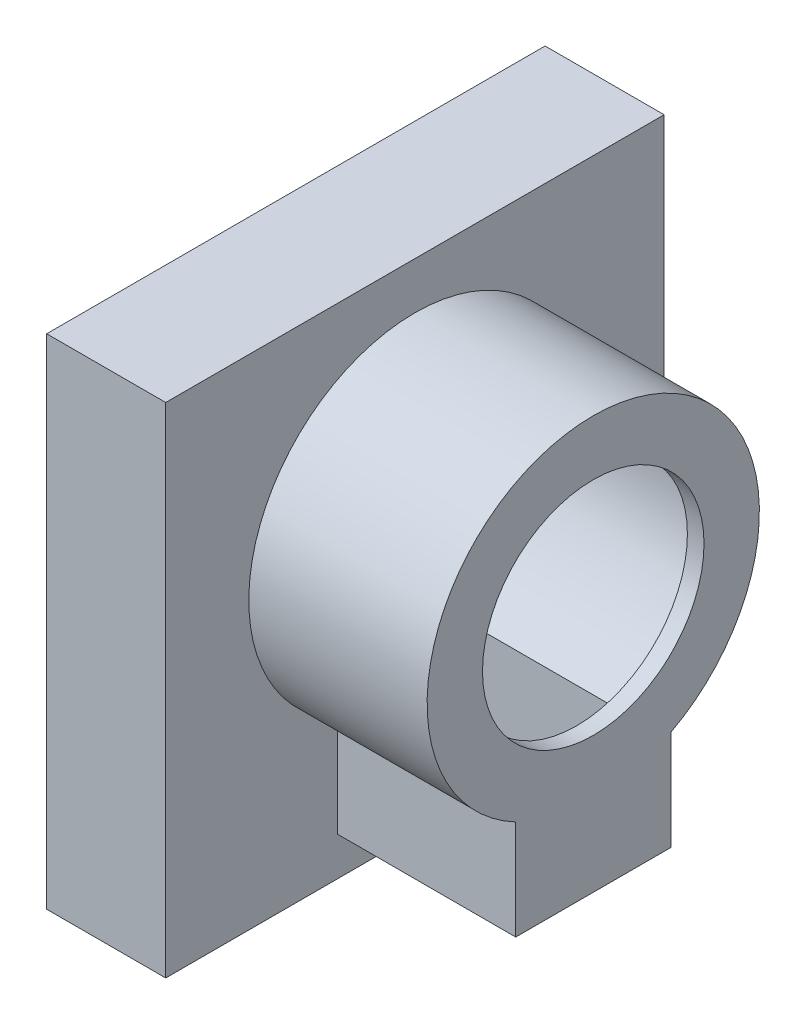
ISO-10303-21;
HEADER;
FILE_DESCRIPTION(('STEP AP214'),'2;1');
FILE_NAME('part.step','',(''),(''),'','','');
FILE_SCHEMA(('AUTOMOTIVE_DESIGN { 1 0 10303 214 1 1 1 1 }'));
ENDSEC;
DATA;
#1=APPLICATION_CONTEXT('core data for automotive mechanical design processes');
#2=APPLICATION_PROTOCOL_DEFINITION('international standard','automotive_design',2000,#1);
#3=PRODUCT_CONTEXT('',#1,'mechanical');
#4=PRODUCT('Part','Part','',(#3));
#5=PRODUCT_RELATED_PRODUCT_CATEGORY('part','',(#4));
#6=PRODUCT_DEFINITION_FORMATION('','',#4);
#7=PRODUCT_DEFINITION_CONTEXT('part definition',#1,'design');
#8=PRODUCT_DEFINITION('design','',#6,#7);
#9=PRODUCT_DEFINITION_SHAPE('','',#8);
#10=(LENGTH_UNIT() NAMED_UNIT(*) SI_UNIT(.MILLI.,.METRE.));
#11=(NAMED_UNIT(*) PLANE_ANGLE_UNIT() SI_UNIT($,.RADIAN.));
#12=(NAMED_UNIT(*) SI_UNIT($,.STERADIAN.) SOLID_ANGLE_UNIT());
#13=UNCERTAINTY_MEASURE_WITH_UNIT(LENGTH_MEASURE(1.E-05),#10,'distance_accuracy_value','');
#14=(GEOMETRIC_REPRESENTATION_CONTEXT(3) GLOBAL_UNCERTAINTY_ASSIGNED_CONTEXT((#13)) GLOBAL_UNIT_ASSIGNED_CONTEXT((#10,
#11,#12)) REPRESENTATION_CONTEXT('',''));
#15=CARTESIAN_POINT('',(0.,0.,0.));
#16=DIRECTION('',(0.,0.,1.));
#17=DIRECTION('',(1.,0.,0.));
#18=AXIS2_PLACEMENT_3D('',#15,#16,#17);
#19=CARTESIAN_POINT('',(0.,0.,0.));
#20=DIRECTION('',(-1.,0.,0.));
#21=DIRECTION('',(0.,0.,1.));
#22=AXIS2_PLACEMENT_3D('',#19,#20,#21);
#23=PLANE('',#22);
#24=DIRECTION('',(0.,1.,0.));
#25=VECTOR('',#24,1.);
#26=CARTESIAN_POINT('',(0.,-9.,-9.));
#27=LINE('',#26,#25);
#28=CARTESIAN_POINT('',(0.,-9.,-9.));
#29=VERTEX_POINT('',#28);
#30=CARTESIAN_POINT('',(0.,9.,-9.));
#31=VERTEX_POINT('',#30);
#32=EDGE_CURVE('E298',#29,#31,#27,.T.);
#33=ORIENTED_EDGE('',*,*,#32,.F.);
#34=DIRECTION('',(0.,0.,-1.));
#35=VECTOR('',#34,1.);
#36=CARTESIAN_POINT('',(0.,-9.,9.));
#37=LINE('',#36,#35);
#38=CARTESIAN_POINT('',(0.,-9.,9.));
#39=VERTEX_POINT('',#38);
#40=EDGE_CURVE('E304',#39,#29,#37,.T.);
#41=ORIENTED_EDGE('',*,*,#40,.F.);
#42=DIRECTION('',(0.,-1.,0.));
#43=VECTOR('',#42,1.);
#44=CARTESIAN_POINT('',(0.,-9.,9.));
#45=LINE('',#44,#43);
#46=CARTESIAN_POINT('',(0.,9.,9.));
#47=VERTEX_POINT('',#46);
#48=EDGE_CURVE('E320',#47,#39,#45,.T.);
#49=ORIENTED_EDGE('',*,*,#48,.F.);
#50=DIRECTION('',(0.,0.,1.));
#51=VECTOR('',#50,1.);
#52=CARTESIAN_POINT('',(0.,9.,9.));
#53=LINE('',#52,#51);
#54=EDGE_CURVE('E317',#31,#47,#53,.T.);
#55=ORIENTED_EDGE('',*,*,#54,.F.);
#56=EDGE_LOOP('',(#33,#41,#49,#55));
#57=FACE_BOUND('',#56,.T.);
#58=DIRECTION('',(0.,0.,-1.));
#59=VECTOR('',#58,1.);
#60=CARTESIAN_POINT('',(0.,-8.4,0.));
#61=LINE('',#60,#59);
#62=CARTESIAN_POINT('',(0.,-8.4,8.4));
#63=VERTEX_POINT('',#62);
#64=CARTESIAN_POINT('',(0.,-8.4,-8.4));
#65=VERTEX_POINT('',#64);
#66=EDGE_CURVE('E248',#63,#65,#61,.T.);
#67=ORIENTED_EDGE('',*,*,#66,.T.);
#68=DIRECTION('',(0.,1.,0.));
#69=VECTOR('',#68,1.);
#70=CARTESIAN_POINT('',(0.,0.,-8.4));
#71=LINE('',#70,#69);
#72=CARTESIAN_POINT('',(0.,8.4,-8.4));
#73=VERTEX_POINT('',#72);
#74=EDGE_CURVE('E219',#65,#73,#71,.T.);
#75=ORIENTED_EDGE('',*,*,#74,.T.);
#76=DIRECTION('',(0.,0.,1.));
#77=VECTOR('',#76,1.);
#78=CARTESIAN_POINT('',(0.,8.4,0.));
#79=LINE('',#78,#77);
#80=CARTESIAN_POINT('',(0.,8.4,8.4));
#81=VERTEX_POINT('',#80);
#82=EDGE_CURVE('E247',#73,#81,#79,.T.);
#83=ORIENTED_EDGE('',*,*,#82,.T.);
#84=DIRECTION('',(0.,-1.,0.));
#85=VECTOR('',#84,1.);
#86=CARTESIAN_POINT('',(0.,0.,8.4));
#87=LINE('',#86,#85);
#88=EDGE_CURVE('E64',#81,#63,#87,.T.);
#89=ORIENTED_EDGE('',*,*,#88,.T.);
#90=EDGE_LOOP('',(#67,#75,#83,#89));
#91=FACE_BOUND('',#90,.T.);
#92=ADVANCED_FACE('F47',(#57,#91),#23,.T.);
#93=CARTESIAN_POINT('',(4.3,0.,0.));
#94=DIRECTION('',(-1.,0.,0.));
#95=DIRECTION('',(0.,0.,1.));
#96=AXIS2_PLACEMENT_3D('',#93,#94,#95);
#97=PLANE('',#96);
#98=DIRECTION('',(0.,1.,0.));
#99=VECTOR('',#98,1.);
#100=CARTESIAN_POINT('',(4.3,-9.,-9.));
#101=LINE('',#100,#99);
#102=CARTESIAN_POINT('',(4.3,-9.,-9.));
#103=VERTEX_POINT('',#102);
#104=CARTESIAN_POINT('',(4.3,9.,-9.));
#105=VERTEX_POINT('',#104);
#106=EDGE_CURVE('E299',#103,#105,#101,.T.);
#107=ORIENTED_EDGE('',*,*,#106,.T.);
#108=DIRECTION('',(0.,0.,1.));
#109=VECTOR('',#108,1.);
#110=CARTESIAN_POINT('',(4.3,9.,9.));
#111=LINE('',#110,#109);
#112=CARTESIAN_POINT('',(4.3,9.,9.));
#113=VERTEX_POINT('',#112);
#114=EDGE_CURVE('E303',#105,#113,#111,.T.);
#115=ORIENTED_EDGE('',*,*,#114,.T.);
#116=DIRECTION('',(0.,-1.,0.));
#117=VECTOR('',#116,1.);
#118=CARTESIAN_POINT('',(4.3,-9.,9.));
#119=LINE('',#118,#117);
#120=CARTESIAN_POINT('',(4.3,-9.,9.));
#121=VERTEX_POINT('',#120);
#122=EDGE_CURVE('E307',#113,#121,#119,.T.);
#123=ORIENTED_EDGE('',*,*,#122,.T.);
#124=DIRECTION('',(0.,0.,-1.));
#125=VECTOR('',#124,1.);
#126=CARTESIAN_POINT('',(4.3,-9.,9.));
#127=LINE('',#126,#125);
#128=EDGE_CURVE('E310',#121,#103,#127,.T.);
#129=ORIENTED_EDGE('',*,*,#128,.T.);
#130=EDGE_LOOP('',(#107,#115,#123,#129));
#131=FACE_BOUND('',#130,.T.);
#132=CARTESIAN_POINT('',(4.3,1.30659966456864,0.));
#133=DIRECTION('',(1.,0.,0.));
#134=DIRECTION('',(0.,0.,-1.));
#135=AXIS2_PLACEMENT_3D('',#132,#133,#134);
#136=CIRCLE('',#135,6.);
#137=CARTESIAN_POINT('',(4.3,-4.,-2.8));
#138=VERTEX_POINT('',#137);
#139=CARTESIAN_POINT('',(4.3,-4.,2.8));
#140=VERTEX_POINT('',#139);
#141=EDGE_CURVE('E72',#138,#140,#136,.T.);
#142=ORIENTED_EDGE('',*,*,#141,.F.);
#143=DIRECTION('',(0.,1.,0.));
#144=VECTOR('',#143,1.);
#145=CARTESIAN_POINT('',(4.3,-7.6,-2.8));
#146=LINE('',#145,#144);
#147=CARTESIAN_POINT('',(4.3,-7.6,-2.8));
#148=VERTEX_POINT('',#147);
#149=EDGE_CURVE('E261',#148,#138,#146,.T.);
#150=ORIENTED_EDGE('',*,*,#149,.F.);
#151=DIRECTION('',(0.,0.,-1.));
#152=VECTOR('',#151,1.);
#153=CARTESIAN_POINT('',(4.3,-7.6,2.8));
#154=LINE('',#153,#152);
#155=CARTESIAN_POINT('',(4.3,-7.6,2.8));
#156=VERTEX_POINT('',#155);
#157=EDGE_CURVE('E277',#156,#148,#154,.T.);
#158=ORIENTED_EDGE('',*,*,#157,.F.);
#159=DIRECTION('',(0.,-1.,0.));
#160=VECTOR('',#159,1.);
#161=CARTESIAN_POINT('',(4.3,-7.6,2.8));
#162=LINE('',#161,#160);
#163=EDGE_CURVE('E273',#140,#156,#162,.T.);
#164=ORIENTED_EDGE('',*,*,#163,.F.);
#165=EDGE_LOOP('',(#142,#150,#158,#164));
#166=FACE_BOUND('',#165,.T.);
#167=ADVANCED_FACE('F353',(#131,#166),#97,.F.);
#168=CARTESIAN_POINT('',(4.3,-9.,-9.));
#169=DIRECTION('',(0.,0.,1.));
#170=DIRECTION('',(1.,0.,0.));
#171=AXIS2_PLACEMENT_3D('',#168,#169,#170);
#172=PLANE('',#171);
#173=ORIENTED_EDGE('',*,*,#32,.T.);
#174=DIRECTION('',(-1.,0.,0.));
#175=VECTOR('',#174,1.);
#176=CARTESIAN_POINT('',(4.3,9.,-9.));
#177=LINE('',#176,#175);
#178=EDGE_CURVE('E11',#105,#31,#177,.T.);
#179=ORIENTED_EDGE('',*,*,#178,.F.);
#180=ORIENTED_EDGE('',*,*,#106,.F.);
#181=DIRECTION('',(-1.,0.,0.));
#182=VECTOR('',#181,1.);
#183=CARTESIAN_POINT('',(4.3,-9.,-9.));
#184=LINE('',#183,#182);
#185=EDGE_CURVE('E313',#103,#29,#184,.T.);
#186=ORIENTED_EDGE('',*,*,#185,.T.);
#187=EDGE_LOOP('',(#173,#179,#180,#186));
#188=FACE_BOUND('',#187,.T.);
#189=ADVANCED_FACE('F49',(#188),#172,.F.);
#190=CARTESIAN_POINT('',(4.3,9.,9.));
#191=DIRECTION('',(0.,-1.,0.));
#192=DIRECTION('',(0.,0.,-1.));
#193=AXIS2_PLACEMENT_3D('',#190,#191,#192);
#194=PLANE('',#193);
#195=ORIENTED_EDGE('',*,*,#54,.T.);
#196=DIRECTION('',(-1.,0.,0.));
#197=VECTOR('',#196,1.);
#198=CARTESIAN_POINT('',(4.3,9.,9.));
#199=LINE('',#198,#197);
#200=EDGE_CURVE('E57',#113,#47,#199,.T.);
#201=ORIENTED_EDGE('',*,*,#200,.F.);
#202=ORIENTED_EDGE('',*,*,#114,.F.);
#203=ORIENTED_EDGE('',*,*,#178,.T.);
#204=EDGE_LOOP('',(#195,#201,#202,#203));
#205=FACE_BOUND('',#204,.T.);
#206=ADVANCED_FACE('F354',(#205),#194,.F.);
#207=CARTESIAN_POINT('',(4.3,-9.,9.));
#208=DIRECTION('',(0.,0.,-1.));
#209=DIRECTION('',(-1.,0.,0.));
#210=AXIS2_PLACEMENT_3D('',#207,#208,#209);
#211=PLANE('',#210);
#212=ORIENTED_EDGE('',*,*,#48,.T.);
#213=DIRECTION('',(-1.,0.,0.));
#214=VECTOR('',#213,1.);
#215=CARTESIAN_POINT('',(4.3,-9.,9.));
#216=LINE('',#215,#214);
#217=EDGE_CURVE('E328',#121,#39,#216,.T.);
#218=ORIENTED_EDGE('',*,*,#217,.F.);
#219=ORIENTED_EDGE('',*,*,#122,.F.);
#220=ORIENTED_EDGE('',*,*,#200,.T.);
#221=EDGE_LOOP('',(#212,#218,#219,#220));
#222=FACE_BOUND('',#221,.T.);
#223=ADVANCED_FACE('F338',(#222),#211,.F.);
#224=CARTESIAN_POINT('',(4.3,-9.,9.));
#225=DIRECTION('',(0.,1.,0.));
#226=DIRECTION('',(0.,0.,1.));
#227=AXIS2_PLACEMENT_3D('',#224,#225,#226);
#228=PLANE('',#227);
#229=ORIENTED_EDGE('',*,*,#40,.T.);
#230=ORIENTED_EDGE('',*,*,#185,.F.);
#231=ORIENTED_EDGE('',*,*,#128,.F.);
#232=ORIENTED_EDGE('',*,*,#217,.T.);
#233=EDGE_LOOP('',(#229,#230,#231,#232));
#234=FACE_BOUND('',#233,.T.);
#235=ADVANCED_FACE('F347',(#234),#228,.F.);
#236=CARTESIAN_POINT('',(10.74,1.30659966456864,0.));
#237=DIRECTION('',(-1.,0.,0.));
#238=DIRECTION('',(0.,0.,1.));
#239=AXIS2_PLACEMENT_3D('',#236,#237,#238);
#240=CYLINDRICAL_SURFACE('',#239,6.);
#241=ORIENTED_EDGE('',*,*,#141,.T.);
#242=DIRECTION('',(-1.,0.,0.));
#243=VECTOR('',#242,1.);
#244=CARTESIAN_POINT('',(10.74,-4.,2.8));
#245=LINE('',#244,#243);
#246=CARTESIAN_POINT('',(10.74,-4.,2.8));
#247=VERTEX_POINT('',#246);
#248=EDGE_CURVE('E294',#247,#140,#245,.T.);
#249=ORIENTED_EDGE('',*,*,#248,.F.);
#250=CARTESIAN_POINT('',(10.74,1.30659966456864,0.));
#251=DIRECTION('',(1.,0.,0.));
#252=DIRECTION('',(0.,0.,-1.));
#253=AXIS2_PLACEMENT_3D('',#250,#251,#252);
#254=CIRCLE('',#253,6.);
#255=CARTESIAN_POINT('',(10.74,-4.,-2.8));
#256=VERTEX_POINT('',#255);
#257=EDGE_CURVE('E256',#256,#247,#254,.T.);
#258=ORIENTED_EDGE('',*,*,#257,.F.);
#259=DIRECTION('',(-1.,0.,0.));
#260=VECTOR('',#259,1.);
#261=CARTESIAN_POINT('',(10.74,-4.,-2.8));
#262=LINE('',#261,#260);
#263=EDGE_CURVE('E270',#256,#138,#262,.T.);
#264=ORIENTED_EDGE('',*,*,#263,.T.);
#265=EDGE_LOOP('',(#241,#249,#258,#264));
#266=FACE_BOUND('',#265,.T.);
#267=ADVANCED_FACE('F372',(#266),#240,.T.);
#268=CARTESIAN_POINT('',(10.74,-7.6,2.8));
#269=DIRECTION('',(0.,0.,-1.));
#270=DIRECTION('',(0.,1.,0.));
#271=AXIS2_PLACEMENT_3D('',#268,#269,#270);
#272=PLANE('',#271);
#273=ORIENTED_EDGE('',*,*,#163,.T.);
#274=DIRECTION('',(-1.,0.,0.));
#275=VECTOR('',#274,1.);
#276=CARTESIAN_POINT('',(10.74,-7.6,2.8));
#277=LINE('',#276,#275);
#278=CARTESIAN_POINT('',(10.74,-7.6,2.8));
#279=VERTEX_POINT('',#278);
#280=EDGE_CURVE('E290',#279,#156,#277,.T.);
#281=ORIENTED_EDGE('',*,*,#280,.F.);
#282=DIRECTION('',(0.,-1.,0.));
#283=VECTOR('',#282,1.);
#284=CARTESIAN_POINT('',(10.74,-7.6,2.8));
#285=LINE('',#284,#283);
#286=EDGE_CURVE('E260',#247,#279,#285,.T.);
#287=ORIENTED_EDGE('',*,*,#286,.F.);
#288=ORIENTED_EDGE('',*,*,#248,.T.);
#289=EDGE_LOOP('',(#273,#281,#287,#288));
#290=FACE_BOUND('',#289,.T.);
#291=ADVANCED_FACE('F376',(#290),#272,.F.);
#292=CARTESIAN_POINT('',(10.74,-7.6,2.8));
#293=DIRECTION('',(0.,1.,0.));
#294=DIRECTION('',(0.,0.,1.));
#295=AXIS2_PLACEMENT_3D('',#292,#293,#294);
#296=PLANE('',#295);
#297=ORIENTED_EDGE('',*,*,#157,.T.);
#298=DIRECTION('',(-1.,0.,0.));
#299=VECTOR('',#298,1.);
#300=CARTESIAN_POINT('',(10.74,-7.6,-2.8));
#301=LINE('',#300,#299);
#302=CARTESIAN_POINT('',(10.74,-7.6,-2.8));
#303=VERTEX_POINT('',#302);
#304=EDGE_CURVE('E286',#303,#148,#301,.T.);
#305=ORIENTED_EDGE('',*,*,#304,.F.);
#306=DIRECTION('',(0.,0.,-1.));
#307=VECTOR('',#306,1.);
#308=CARTESIAN_POINT('',(10.74,-7.6,2.8));
#309=LINE('',#308,#307);
#310=EDGE_CURVE('E264',#279,#303,#309,.T.);
#311=ORIENTED_EDGE('',*,*,#310,.F.);
#312=ORIENTED_EDGE('',*,*,#280,.T.);
#313=EDGE_LOOP('',(#297,#305,#311,#312));
#314=FACE_BOUND('',#313,.T.);
#315=ADVANCED_FACE('F381',(#314),#296,.F.);
#316=CARTESIAN_POINT('',(10.74,-7.6,-2.8));
#317=DIRECTION('',(0.,0.,1.));
#318=DIRECTION('',(0.,-1.,0.));
#319=AXIS2_PLACEMENT_3D('',#316,#317,#318);
#320=PLANE('',#319);
#321=ORIENTED_EDGE('',*,*,#149,.T.);
#322=ORIENTED_EDGE('',*,*,#263,.F.);
#323=DIRECTION('',(0.,1.,0.));
#324=VECTOR('',#323,1.);
#325=CARTESIAN_POINT('',(10.74,-7.6,-2.8));
#326=LINE('',#325,#324);
#327=EDGE_CURVE('E267',#303,#256,#326,.T.);
#328=ORIENTED_EDGE('',*,*,#327,.F.);
#329=ORIENTED_EDGE('',*,*,#304,.T.);
#330=EDGE_LOOP('',(#321,#322,#328,#329));
#331=FACE_BOUND('',#330,.T.);
#332=ADVANCED_FACE('F387',(#331),#320,.F.);
#333=CARTESIAN_POINT('',(10.74,1.30659966456864,0.));
#334=DIRECTION('',(1.,0.,0.));
#335=DIRECTION('',(0.,0.,-1.));
#336=AXIS2_PLACEMENT_3D('',#333,#334,#335);
#337=PLANE('',#336);
#338=CARTESIAN_POINT('',(10.74,1.30659966456862,0.));
#339=DIRECTION('',(1.,0.,0.));
#340=DIRECTION('',(0.,0.,-1.));
#341=AXIS2_PLACEMENT_3D('',#338,#339,#340);
#342=CIRCLE('',#341,4.);
#343=CARTESIAN_POINT('',(10.74,1.30659966456862,-4.));
#344=VERTEX_POINT('',#343);
#345=EDGE_CURVE('E436',#344,#344,#342,.T.);
#346=ORIENTED_EDGE('',*,*,#345,.F.);
#347=EDGE_LOOP('',(#346));
#348=FACE_BOUND('',#347,.T.);
#349=ORIENTED_EDGE('',*,*,#257,.T.);
#350=ORIENTED_EDGE('',*,*,#286,.T.);
#351=ORIENTED_EDGE('',*,*,#310,.T.);
#352=ORIENTED_EDGE('',*,*,#327,.T.);
#353=EDGE_LOOP('',(#349,#350,#351,#352));
#354=FACE_BOUND('',#353,.T.);
#355=ADVANCED_FACE('F390',(#348,#354),#337,.T.);
#356=CARTESIAN_POINT('',(3.7,0.,0.));
#357=DIRECTION('',(-1.,0.,0.));
#358=DIRECTION('',(0.,0.,1.));
#359=AXIS2_PLACEMENT_3D('',#356,#357,#358);
#360=PLANE('',#359);
#361=DIRECTION('',(0.,1.,0.));
#362=VECTOR('',#361,1.);
#363=CARTESIAN_POINT('',(3.7,0.,-8.4));
#364=LINE('',#363,#362);
#365=CARTESIAN_POINT('',(3.7,-8.4,-8.4));
#366=VERTEX_POINT('',#365);
#367=CARTESIAN_POINT('',(3.7,8.4,-8.4));
#368=VERTEX_POINT('',#367);
#369=EDGE_CURVE('E174',#366,#368,#364,.T.);
#370=ORIENTED_EDGE('',*,*,#369,.F.);
#371=DIRECTION('',(0.,0.,-1.));
#372=VECTOR('',#371,1.);
#373=CARTESIAN_POINT('',(3.7,-8.4,0.));
#374=LINE('',#373,#372);
#375=CARTESIAN_POINT('',(3.7,-8.4,8.4));
#376=VERTEX_POINT('',#375);
#377=EDGE_CURVE('E184',#376,#366,#374,.T.);
#378=ORIENTED_EDGE('',*,*,#377,.F.);
#379=DIRECTION('',(0.,-1.,0.));
#380=VECTOR('',#379,1.);
#381=CARTESIAN_POINT('',(3.7,0.,8.4));
#382=LINE('',#381,#380);
#383=CARTESIAN_POINT('',(3.7,8.4,8.4));
#384=VERTEX_POINT('',#383);
#385=EDGE_CURVE('E173',#384,#376,#382,.T.);
#386=ORIENTED_EDGE('',*,*,#385,.F.);
#387=DIRECTION('',(0.,0.,1.));
#388=VECTOR('',#387,1.);
#389=CARTESIAN_POINT('',(3.7,8.4,0.));
#390=LINE('',#389,#388);
#391=EDGE_CURVE('E162',#368,#384,#390,.T.);
#392=ORIENTED_EDGE('',*,*,#391,.F.);
#393=EDGE_LOOP('',(#370,#378,#386,#392));
#394=FACE_BOUND('',#393,.T.);
#395=CARTESIAN_POINT('',(3.7,1.30659966456864,0.));
#396=DIRECTION('',(-1.,0.,0.));
#397=DIRECTION('',(0.,0.,1.));
#398=AXIS2_PLACEMENT_3D('',#395,#396,#397);
#399=CIRCLE('',#398,5.4);
#400=CARTESIAN_POINT('',(3.7,-3.62493153780669,-2.2));
#401=VERTEX_POINT('',#400);
#402=CARTESIAN_POINT('',(3.7,-3.62493153780669,2.2));
#403=VERTEX_POINT('',#402);
#404=EDGE_CURVE('E192',#401,#403,#399,.F.);
#405=ORIENTED_EDGE('',*,*,#404,.T.);
#406=DIRECTION('',(0.,-1.,0.));
#407=VECTOR('',#406,1.);
#408=CARTESIAN_POINT('',(3.7,0.,2.2));
#409=LINE('',#408,#407);
#410=CARTESIAN_POINT('',(3.7,-7.,2.2));
#411=VERTEX_POINT('',#410);
#412=EDGE_CURVE('E196',#403,#411,#409,.T.);
#413=ORIENTED_EDGE('',*,*,#412,.T.);
#414=DIRECTION('',(0.,0.,-1.));
#415=VECTOR('',#414,1.);
#416=CARTESIAN_POINT('',(3.7,-7.,0.));
#417=LINE('',#416,#415);
#418=CARTESIAN_POINT('',(3.7,-7.,-2.2));
#419=VERTEX_POINT('',#418);
#420=EDGE_CURVE('E202',#411,#419,#417,.T.);
#421=ORIENTED_EDGE('',*,*,#420,.T.);
#422=DIRECTION('',(0.,1.,0.));
#423=VECTOR('',#422,1.);
#424=CARTESIAN_POINT('',(3.7,0.,-2.2));
#425=LINE('',#424,#423);
#426=EDGE_CURVE('E197',#419,#401,#425,.T.);
#427=ORIENTED_EDGE('',*,*,#426,.T.);
#428=EDGE_LOOP('',(#405,#413,#421,#427));
#429=FACE_BOUND('',#428,.T.);
#430=ADVANCED_FACE('F182',(#394,#429),#360,.T.);
#431=CARTESIAN_POINT('',(4.3,-9.,-8.4));
#432=DIRECTION('',(0.,0.,1.));
#433=DIRECTION('',(1.,0.,0.));
#434=AXIS2_PLACEMENT_3D('',#431,#432,#433);
#435=PLANE('',#434);
#436=ORIENTED_EDGE('',*,*,#74,.F.);
#437=DIRECTION('',(-1.,0.,0.));
#438=VECTOR('',#437,1.);
#439=CARTESIAN_POINT('',(4.3,-8.4,-8.4));
#440=LINE('',#439,#438);
#441=EDGE_CURVE('E188',#366,#65,#440,.T.);
#442=ORIENTED_EDGE('',*,*,#441,.F.);
#443=ORIENTED_EDGE('',*,*,#369,.T.);
#444=DIRECTION('',(-1.,0.,0.));
#445=VECTOR('',#444,1.);
#446=CARTESIAN_POINT('',(4.3,8.4,-8.4));
#447=LINE('',#446,#445);
#448=EDGE_CURVE('E167',#368,#73,#447,.T.);
#449=ORIENTED_EDGE('',*,*,#448,.T.);
#450=EDGE_LOOP('',(#436,#442,#443,#449));
#451=FACE_BOUND('',#450,.T.);
#452=ADVANCED_FACE('F424',(#451),#435,.T.);
#453=CARTESIAN_POINT('',(4.3,8.4,9.));
#454=DIRECTION('',(0.,-1.,0.));
#455=DIRECTION('',(0.,0.,-1.));
#456=AXIS2_PLACEMENT_3D('',#453,#454,#455);
#457=PLANE('',#456);
#458=ORIENTED_EDGE('',*,*,#82,.F.);
#459=ORIENTED_EDGE('',*,*,#448,.F.);
#460=ORIENTED_EDGE('',*,*,#391,.T.);
#461=DIRECTION('',(-1.,0.,0.));
#462=VECTOR('',#461,1.);
#463=CARTESIAN_POINT('',(4.3,8.4,8.4));
#464=LINE('',#463,#462);
#465=EDGE_CURVE('E164',#384,#81,#464,.T.);
#466=ORIENTED_EDGE('',*,*,#465,.T.);
#467=EDGE_LOOP('',(#458,#459,#460,#466));
#468=FACE_BOUND('',#467,.T.);
#469=ADVANCED_FACE('F163',(#468),#457,.T.);
#470=CARTESIAN_POINT('',(4.3,-9.,8.4));
#471=DIRECTION('',(0.,0.,-1.));
#472=DIRECTION('',(-1.,0.,0.));
#473=AXIS2_PLACEMENT_3D('',#470,#471,#472);
#474=PLANE('',#473);
#475=ORIENTED_EDGE('',*,*,#88,.F.);
#476=ORIENTED_EDGE('',*,*,#465,.F.);
#477=ORIENTED_EDGE('',*,*,#385,.T.);
#478=DIRECTION('',(-1.,0.,0.));
#479=VECTOR('',#478,1.);
#480=CARTESIAN_POINT('',(4.3,-8.4,8.4));
#481=LINE('',#480,#479);
#482=EDGE_CURVE('E179',#376,#63,#481,.T.);
#483=ORIENTED_EDGE('',*,*,#482,.T.);
#484=EDGE_LOOP('',(#475,#476,#477,#483));
#485=FACE_BOUND('',#484,.T.);
#486=ADVANCED_FACE('F176',(#485),#474,.T.);
#487=CARTESIAN_POINT('',(4.3,-8.4,9.));
#488=DIRECTION('',(0.,1.,0.));
#489=DIRECTION('',(0.,0.,1.));
#490=AXIS2_PLACEMENT_3D('',#487,#488,#489);
#491=PLANE('',#490);
#492=ORIENTED_EDGE('',*,*,#66,.F.);
#493=ORIENTED_EDGE('',*,*,#482,.F.);
#494=ORIENTED_EDGE('',*,*,#377,.T.);
#495=ORIENTED_EDGE('',*,*,#441,.T.);
#496=EDGE_LOOP('',(#492,#493,#494,#495));
#497=FACE_BOUND('',#496,.T.);
#498=ADVANCED_FACE('F415',(#497),#491,.T.);
#499=CARTESIAN_POINT('',(10.74,1.30659966456864,0.));
#500=DIRECTION('',(-1.,0.,0.));
#501=DIRECTION('',(0.,0.,1.));
#502=AXIS2_PLACEMENT_3D('',#499,#500,#501);
#503=CYLINDRICAL_SURFACE('',#502,5.4);
#504=ORIENTED_EDGE('',*,*,#404,.F.);
#505=DIRECTION('',(-1.,0.,0.));
#506=VECTOR('',#505,1.);
#507=CARTESIAN_POINT('',(10.14,-3.62493153780669,-2.2));
#508=LINE('',#507,#506);
#509=CARTESIAN_POINT('',(10.14,-3.62493153780669,-2.2));
#510=VERTEX_POINT('',#509);
#511=EDGE_CURVE('E225',#510,#401,#508,.T.);
#512=ORIENTED_EDGE('',*,*,#511,.F.);
#513=CARTESIAN_POINT('',(10.14,1.30659966456864,0.));
#514=DIRECTION('',(1.,0.,0.));
#515=DIRECTION('',(0.,0.,-1.));
#516=AXIS2_PLACEMENT_3D('',#513,#514,#515);
#517=CIRCLE('',#516,5.4);
#518=CARTESIAN_POINT('',(10.14,-3.62493153780669,2.2));
#519=VERTEX_POINT('',#518);
#520=EDGE_CURVE('E201',#510,#519,#517,.T.);
#521=ORIENTED_EDGE('',*,*,#520,.T.);
#522=DIRECTION('',(-1.,0.,0.));
#523=VECTOR('',#522,1.);
#524=CARTESIAN_POINT('',(10.14,-3.62493153780669,2.2));
#525=LINE('',#524,#523);
#526=EDGE_CURVE('E215',#519,#403,#525,.T.);
#527=ORIENTED_EDGE('',*,*,#526,.T.);
#528=EDGE_LOOP('',(#504,#512,#521,#527));
#529=FACE_BOUND('',#528,.T.);
#530=ADVANCED_FACE('F411',(#529),#503,.F.);
#531=CARTESIAN_POINT('',(10.74,-7.6,2.2));
#532=DIRECTION('',(0.,0.,-1.));
#533=DIRECTION('',(0.,1.,0.));
#534=AXIS2_PLACEMENT_3D('',#531,#532,#533);
#535=PLANE('',#534);
#536=ORIENTED_EDGE('',*,*,#412,.F.);
#537=ORIENTED_EDGE('',*,*,#526,.F.);
#538=DIRECTION('',(0.,-1.,0.));
#539=VECTOR('',#538,1.);
#540=CARTESIAN_POINT('',(10.14,-7.6,2.2));
#541=LINE('',#540,#539);
#542=CARTESIAN_POINT('',(10.14,-7.,2.2));
#543=VERTEX_POINT('',#542);
#544=EDGE_CURVE('E224',#519,#543,#541,.T.);
#545=ORIENTED_EDGE('',*,*,#544,.T.);
#546=DIRECTION('',(-1.,0.,0.));
#547=VECTOR('',#546,1.);
#548=CARTESIAN_POINT('',(10.74,-7.,2.2));
#549=LINE('',#548,#547);
#550=EDGE_CURVE('E220',#543,#411,#549,.T.);
#551=ORIENTED_EDGE('',*,*,#550,.T.);
#552=EDGE_LOOP('',(#536,#537,#545,#551));
#553=FACE_BOUND('',#552,.T.);
#554=ADVANCED_FACE('F407',(#553),#535,.T.);
#555=CARTESIAN_POINT('',(10.74,-7.,2.8));
#556=DIRECTION('',(0.,1.,0.));
#557=DIRECTION('',(0.,0.,1.));
#558=AXIS2_PLACEMENT_3D('',#555,#556,#557);
#559=PLANE('',#558);
#560=ORIENTED_EDGE('',*,*,#420,.F.);
#561=ORIENTED_EDGE('',*,*,#550,.F.);
#562=DIRECTION('',(0.,0.,-1.));
#563=VECTOR('',#562,1.);
#564=CARTESIAN_POINT('',(10.14,-7.,2.8));
#565=LINE('',#564,#563);
#566=CARTESIAN_POINT('',(10.14,-7.,-2.2));
#567=VERTEX_POINT('',#566);
#568=EDGE_CURVE('E236',#543,#567,#565,.T.);
#569=ORIENTED_EDGE('',*,*,#568,.T.);
#570=DIRECTION('',(-1.,0.,0.));
#571=VECTOR('',#570,1.);
#572=CARTESIAN_POINT('',(10.74,-7.,-2.2));
#573=LINE('',#572,#571);
#574=EDGE_CURVE('E229',#567,#419,#573,.T.);
#575=ORIENTED_EDGE('',*,*,#574,.T.);
#576=EDGE_LOOP('',(#560,#561,#569,#575));
#577=FACE_BOUND('',#576,.T.);
#578=ADVANCED_FACE('F403',(#577),#559,.T.);
#579=CARTESIAN_POINT('',(10.74,-7.6,-2.2));
#580=DIRECTION('',(0.,0.,1.));
#581=DIRECTION('',(0.,-1.,0.));
#582=AXIS2_PLACEMENT_3D('',#579,#580,#581);
#583=PLANE('',#582);
#584=ORIENTED_EDGE('',*,*,#426,.F.);
#585=ORIENTED_EDGE('',*,*,#574,.F.);
#586=DIRECTION('',(0.,1.,0.));
#587=VECTOR('',#586,1.);
#588=CARTESIAN_POINT('',(10.14,-7.6,-2.2));
#589=LINE('',#588,#587);
#590=EDGE_CURVE('E230',#567,#510,#589,.T.);
#591=ORIENTED_EDGE('',*,*,#590,.T.);
#592=ORIENTED_EDGE('',*,*,#511,.T.);
#593=EDGE_LOOP('',(#584,#585,#591,#592));
#594=FACE_BOUND('',#593,.T.);
#595=ADVANCED_FACE('F399',(#594),#583,.T.);
#596=CARTESIAN_POINT('',(10.14,1.30659966456864,0.));
#597=DIRECTION('',(1.,0.,0.));
#598=DIRECTION('',(0.,0.,-1.));
#599=AXIS2_PLACEMENT_3D('',#596,#597,#598);
#600=PLANE('',#599);
#601=CARTESIAN_POINT('',(10.14,1.30659966456862,0.));
#602=DIRECTION('',(1.,0.,0.));
#603=DIRECTION('',(0.,0.,-1.));
#604=AXIS2_PLACEMENT_3D('',#601,#602,#603);
#605=CIRCLE('',#604,4.);
#606=CARTESIAN_POINT('',(10.14,1.30659966456862,-4.));
#607=VERTEX_POINT('',#606);
#608=EDGE_CURVE('E51',#607,#607,#605,.T.);
#609=ORIENTED_EDGE('',*,*,#608,.T.);
#610=EDGE_LOOP('',(#609));
#611=FACE_BOUND('',#610,.T.);
#612=ORIENTED_EDGE('',*,*,#520,.F.);
#613=ORIENTED_EDGE('',*,*,#590,.F.);
#614=ORIENTED_EDGE('',*,*,#568,.F.);
#615=ORIENTED_EDGE('',*,*,#544,.F.);
#616=EDGE_LOOP('',(#612,#613,#614,#615));
#617=FACE_BOUND('',#616,.T.);
#618=ADVANCED_FACE('F395',(#611,#617),#600,.F.);
#619=CARTESIAN_POINT('',(0.,1.30659966456862,0.));
#620=DIRECTION('',(1.,0.,0.));
#621=DIRECTION('',(0.,0.,-1.));
#622=AXIS2_PLACEMENT_3D('',#619,#620,#621);
#623=CYLINDRICAL_SURFACE('',#622,4.);
#624=ORIENTED_EDGE('',*,*,#345,.T.);
#625=EDGE_LOOP('',(#624));
#626=FACE_BOUND('',#625,.T.);
#627=ORIENTED_EDGE('',*,*,#608,.F.);
#628=EDGE_LOOP('',(#627));
#629=FACE_BOUND('',#628,.T.);
#630=ADVANCED_FACE('F398',(#626,#629),#623,.F.);
#631=CLOSED_SHELL('',(#92,#167,#189,#206,#223,#235,#267,#291,#315,#332,#355,#430,#452,#469,#486,
#498,#530,#554,#578,#595,#618,#630));
#632=MANIFOLD_SOLID_BREP('B2',#631);
#633=ADVANCED_BREP_SHAPE_REPRESENTATION('',(#18,#632),#14);
#634=SHAPE_DEFINITION_REPRESENTATION(#9,#633);
ENDSEC;
END-ISO-10303-21;
